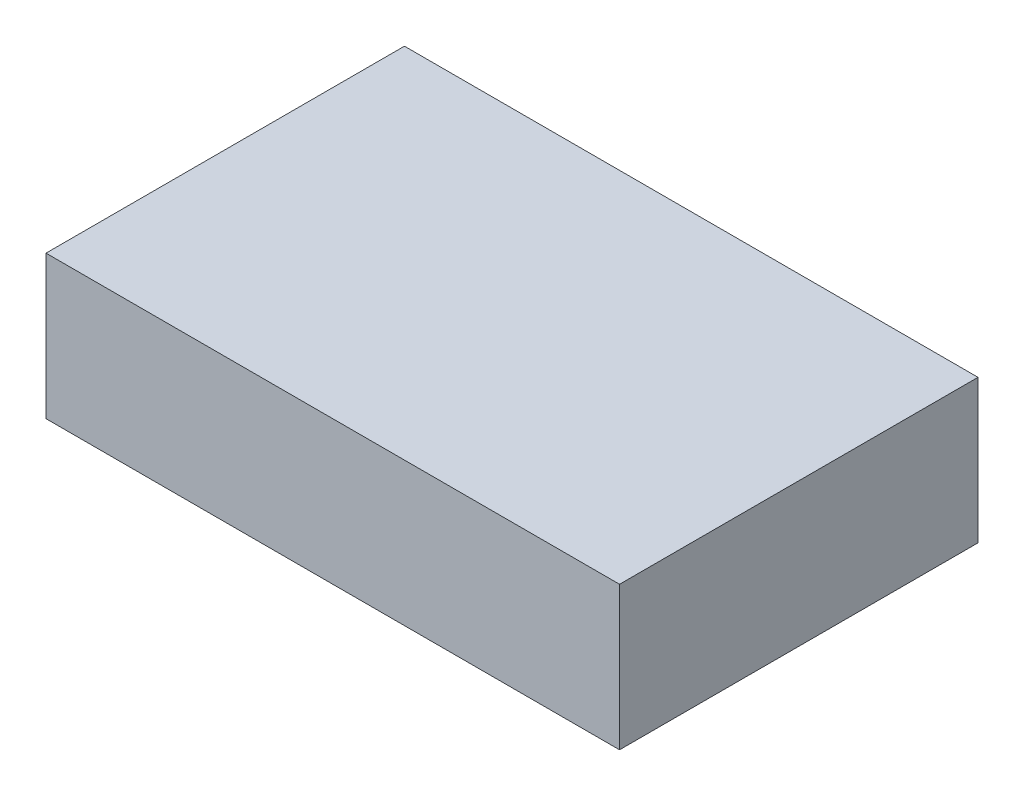
ISO-10303-21;
HEADER;
FILE_DESCRIPTION(('STEP AP214'),'2;1');
FILE_NAME('part.step','',(''),(''),'','','');
FILE_SCHEMA(('AUTOMOTIVE_DESIGN { 1 0 10303 214 1 1 1 1 }'));
ENDSEC;
DATA;
#1=APPLICATION_CONTEXT('core data for automotive mechanical design processes');
#2=APPLICATION_PROTOCOL_DEFINITION('international standard','automotive_design',2000,#1);
#3=PRODUCT_CONTEXT('',#1,'mechanical');
#4=PRODUCT('Part','Part','',(#3));
#5=PRODUCT_RELATED_PRODUCT_CATEGORY('part','',(#4));
#6=PRODUCT_DEFINITION_FORMATION('','',#4);
#7=PRODUCT_DEFINITION_CONTEXT('part definition',#1,'design');
#8=PRODUCT_DEFINITION('design','',#6,#7);
#9=PRODUCT_DEFINITION_SHAPE('','',#8);
#10=(LENGTH_UNIT() NAMED_UNIT(*) SI_UNIT(.MILLI.,.METRE.));
#11=(NAMED_UNIT(*) PLANE_ANGLE_UNIT() SI_UNIT($,.RADIAN.));
#12=(NAMED_UNIT(*) SI_UNIT($,.STERADIAN.) SOLID_ANGLE_UNIT());
#13=UNCERTAINTY_MEASURE_WITH_UNIT(LENGTH_MEASURE(1.E-05),#10,'distance_accuracy_value','');
#14=(GEOMETRIC_REPRESENTATION_CONTEXT(3) GLOBAL_UNCERTAINTY_ASSIGNED_CONTEXT((#13)) GLOBAL_UNIT_ASSIGNED_CONTEXT((#10,
#11,#12)) REPRESENTATION_CONTEXT('',''));
#15=CARTESIAN_POINT('',(0.,0.,0.));
#16=DIRECTION('',(0.,0.,1.));
#17=DIRECTION('',(1.,0.,0.));
#18=AXIS2_PLACEMENT_3D('',#15,#16,#17);
#19=CARTESIAN_POINT('',(-20.,10.,12.5));
#20=DIRECTION('',(0.,0.,-1.));
#21=DIRECTION('',(-1.,0.,0.));
#22=AXIS2_PLACEMENT_3D('',#19,#20,#21);
#23=PLANE('',#22);
#24=DIRECTION('',(1.,0.,0.));
#25=VECTOR('',#24,1.);
#26=CARTESIAN_POINT('',(-20.,0.,12.5));
#27=LINE('',#26,#25);
#28=CARTESIAN_POINT('',(-20.,0.,12.5));
#29=VERTEX_POINT('',#28);
#30=CARTESIAN_POINT('',(20.,0.,12.5));
#31=VERTEX_POINT('',#30);
#32=EDGE_CURVE('E96',#29,#31,#27,.T.);
#33=ORIENTED_EDGE('',*,*,#32,.T.);
#34=DIRECTION('',(0.,-1.,0.));
#35=VECTOR('',#34,1.);
#36=CARTESIAN_POINT('',(20.,10.,12.5));
#37=LINE('',#36,#35);
#38=CARTESIAN_POINT('',(20.,10.,12.5));
#39=VERTEX_POINT('',#38);
#40=EDGE_CURVE('E11',#39,#31,#37,.T.);
#41=ORIENTED_EDGE('',*,*,#40,.F.);
#42=DIRECTION('',(1.,0.,0.));
#43=VECTOR('',#42,1.);
#44=CARTESIAN_POINT('',(-20.,10.,12.5));
#45=LINE('',#44,#43);
#46=CARTESIAN_POINT('',(-20.,10.,12.5));
#47=VERTEX_POINT('',#46);
#48=EDGE_CURVE('E82',#47,#39,#45,.T.);
#49=ORIENTED_EDGE('',*,*,#48,.F.);
#50=DIRECTION('',(0.,-1.,0.));
#51=VECTOR('',#50,1.);
#52=CARTESIAN_POINT('',(-20.,10.,12.5));
#53=LINE('',#52,#51);
#54=EDGE_CURVE('E49',#47,#29,#53,.T.);
#55=ORIENTED_EDGE('',*,*,#54,.T.);
#56=EDGE_LOOP('',(#33,#41,#49,#55));
#57=FACE_BOUND('',#56,.T.);
#58=ADVANCED_FACE('F33',(#57),#23,.F.);
#59=CARTESIAN_POINT('',(20.,10.,12.5));
#60=DIRECTION('',(-1.,0.,0.));
#61=DIRECTION('',(0.,0.,1.));
#62=AXIS2_PLACEMENT_3D('',#59,#60,#61);
#63=PLANE('',#62);
#64=DIRECTION('',(0.,0.,-1.));
#65=VECTOR('',#64,1.);
#66=CARTESIAN_POINT('',(20.,0.,12.5));
#67=LINE('',#66,#65);
#68=CARTESIAN_POINT('',(20.,0.,-12.5));
#69=VERTEX_POINT('',#68);
#70=EDGE_CURVE('E87',#31,#69,#67,.T.);
#71=ORIENTED_EDGE('',*,*,#70,.T.);
#72=DIRECTION('',(0.,-1.,0.));
#73=VECTOR('',#72,1.);
#74=CARTESIAN_POINT('',(20.,10.,-12.5));
#75=LINE('',#74,#73);
#76=CARTESIAN_POINT('',(20.,10.,-12.5));
#77=VERTEX_POINT('',#76);
#78=EDGE_CURVE('E41',#77,#69,#75,.T.);
#79=ORIENTED_EDGE('',*,*,#78,.F.);
#80=DIRECTION('',(0.,0.,-1.));
#81=VECTOR('',#80,1.);
#82=CARTESIAN_POINT('',(20.,10.,12.5));
#83=LINE('',#82,#81);
#84=EDGE_CURVE('E74',#39,#77,#83,.T.);
#85=ORIENTED_EDGE('',*,*,#84,.F.);
#86=ORIENTED_EDGE('',*,*,#40,.T.);
#87=EDGE_LOOP('',(#71,#79,#85,#86));
#88=FACE_BOUND('',#87,.T.);
#89=ADVANCED_FACE('F86',(#88),#63,.F.);
#90=CARTESIAN_POINT('',(-20.,10.,-12.5));
#91=DIRECTION('',(0.,0.,-1.));
#92=DIRECTION('',(-1.,0.,0.));
#93=AXIS2_PLACEMENT_3D('',#90,#91,#92);
#94=PLANE('',#93);
#95=DIRECTION('',(1.,0.,0.));
#96=VECTOR('',#95,1.);
#97=CARTESIAN_POINT('',(-20.,0.,-12.5));
#98=LINE('',#97,#96);
#99=CARTESIAN_POINT('',(-20.,0.,-12.5));
#100=VERTEX_POINT('',#99);
#101=EDGE_CURVE('E99',#100,#69,#98,.T.);
#102=ORIENTED_EDGE('',*,*,#101,.F.);
#103=DIRECTION('',(0.,-1.,0.));
#104=VECTOR('',#103,1.);
#105=CARTESIAN_POINT('',(-20.,10.,-12.5));
#106=LINE('',#105,#104);
#107=CARTESIAN_POINT('',(-20.,10.,-12.5));
#108=VERTEX_POINT('',#107);
#109=EDGE_CURVE('E63',#108,#100,#106,.T.);
#110=ORIENTED_EDGE('',*,*,#109,.F.);
#111=DIRECTION('',(1.,0.,0.));
#112=VECTOR('',#111,1.);
#113=CARTESIAN_POINT('',(-20.,10.,-12.5));
#114=LINE('',#113,#112);
#115=EDGE_CURVE('E81',#108,#77,#114,.T.);
#116=ORIENTED_EDGE('',*,*,#115,.T.);
#117=ORIENTED_EDGE('',*,*,#78,.T.);
#118=EDGE_LOOP('',(#102,#110,#116,#117));
#119=FACE_BOUND('',#118,.T.);
#120=ADVANCED_FACE('F90',(#119),#94,.T.);
#121=CARTESIAN_POINT('',(-20.,10.,12.5));
#122=DIRECTION('',(-1.,0.,0.));
#123=DIRECTION('',(0.,0.,1.));
#124=AXIS2_PLACEMENT_3D('',#121,#122,#123);
#125=PLANE('',#124);
#126=DIRECTION('',(0.,0.,-1.));
#127=VECTOR('',#126,1.);
#128=CARTESIAN_POINT('',(-20.,0.,12.5));
#129=LINE('',#128,#127);
#130=EDGE_CURVE('E101',#29,#100,#129,.T.);
#131=ORIENTED_EDGE('',*,*,#130,.F.);
#132=ORIENTED_EDGE('',*,*,#54,.F.);
#133=DIRECTION('',(0.,0.,-1.));
#134=VECTOR('',#133,1.);
#135=CARTESIAN_POINT('',(-20.,10.,12.5));
#136=LINE('',#135,#134);
#137=EDGE_CURVE('E91',#47,#108,#136,.T.);
#138=ORIENTED_EDGE('',*,*,#137,.T.);
#139=ORIENTED_EDGE('',*,*,#109,.T.);
#140=EDGE_LOOP('',(#131,#132,#138,#139));
#141=FACE_BOUND('',#140,.T.);
#142=ADVANCED_FACE('F107',(#141),#125,.T.);
#143=CARTESIAN_POINT('',(0.,10.,0.));
#144=DIRECTION('',(0.,1.,0.));
#145=DIRECTION('',(0.,0.,1.));
#146=AXIS2_PLACEMENT_3D('',#143,#144,#145);
#147=PLANE('',#146);
#148=ORIENTED_EDGE('',*,*,#48,.T.);
#149=ORIENTED_EDGE('',*,*,#84,.T.);
#150=ORIENTED_EDGE('',*,*,#115,.F.);
#151=ORIENTED_EDGE('',*,*,#137,.F.);
#152=EDGE_LOOP('',(#148,#149,#150,#151));
#153=FACE_BOUND('',#152,.T.);
#154=ADVANCED_FACE('F78',(#153),#147,.T.);
#155=CARTESIAN_POINT('',(0.,0.,0.));
#156=DIRECTION('',(0.,1.,0.));
#157=DIRECTION('',(0.,0.,1.));
#158=AXIS2_PLACEMENT_3D('',#155,#156,#157);
#159=PLANE('',#158);
#160=ORIENTED_EDGE('',*,*,#32,.F.);
#161=ORIENTED_EDGE('',*,*,#130,.T.);
#162=ORIENTED_EDGE('',*,*,#101,.T.);
#163=ORIENTED_EDGE('',*,*,#70,.F.);
#164=EDGE_LOOP('',(#160,#161,#162,#163));
#165=FACE_BOUND('',#164,.T.);
#166=ADVANCED_FACE('F106',(#165),#159,.F.);
#167=CLOSED_SHELL('',(#58,#89,#120,#142,#154,#166));
#168=MANIFOLD_SOLID_BREP('B2',#167);
#169=ADVANCED_BREP_SHAPE_REPRESENTATION('',(#18,#168),#14);
#170=SHAPE_DEFINITION_REPRESENTATION(#9,#169);
ENDSEC;
END-ISO-10303-21;
